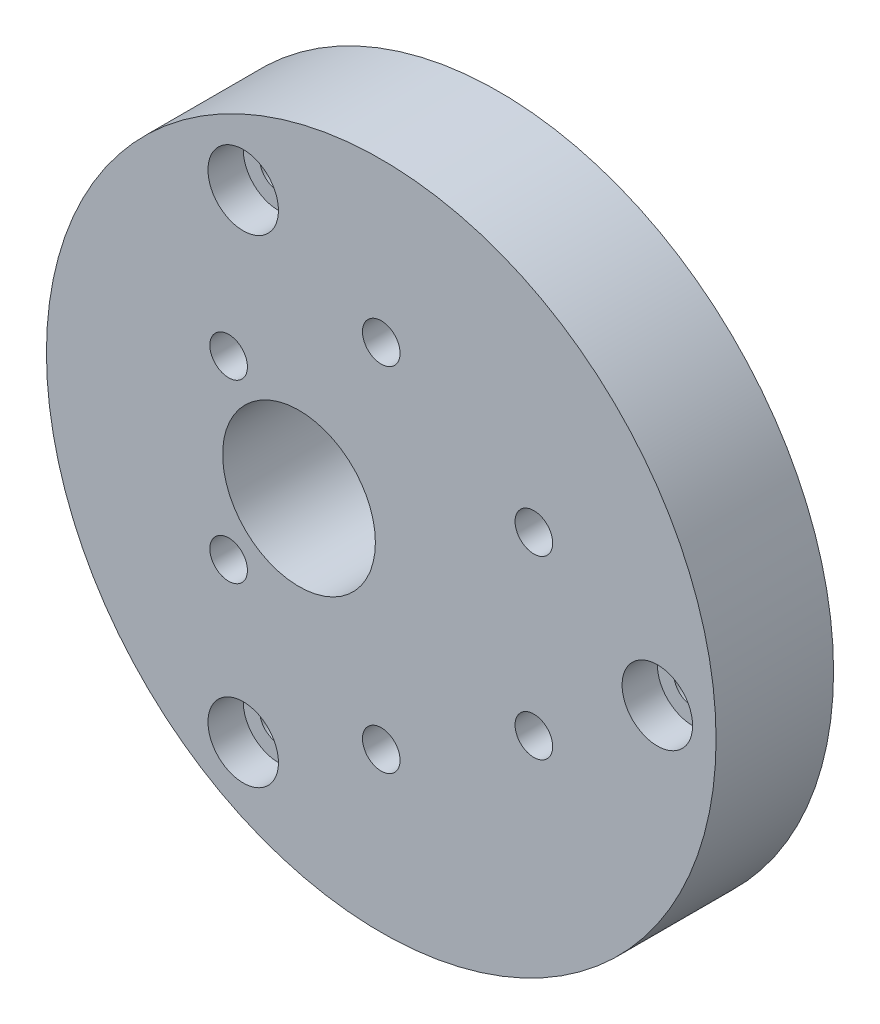
ISO-10303-21;
HEADER;
FILE_DESCRIPTION(('STEP AP214'),'2;1');
FILE_NAME('part.step','',(''),(''),'','','');
FILE_SCHEMA(('AUTOMOTIVE_DESIGN { 1 0 10303 214 1 1 1 1 }'));
ENDSEC;
DATA;
#1=APPLICATION_CONTEXT('core data for automotive mechanical design processes');
#2=APPLICATION_PROTOCOL_DEFINITION('international standard','automotive_design',2000,#1);
#3=PRODUCT_CONTEXT('',#1,'mechanical');
#4=PRODUCT('Part','Part','',(#3));
#5=PRODUCT_RELATED_PRODUCT_CATEGORY('part','',(#4));
#6=PRODUCT_DEFINITION_FORMATION('','',#4);
#7=PRODUCT_DEFINITION_CONTEXT('part definition',#1,'design');
#8=PRODUCT_DEFINITION('design','',#6,#7);
#9=PRODUCT_DEFINITION_SHAPE('','',#8);
#10=(LENGTH_UNIT() NAMED_UNIT(*) SI_UNIT(.MILLI.,.METRE.));
#11=(NAMED_UNIT(*) PLANE_ANGLE_UNIT() SI_UNIT($,.RADIAN.));
#12=(NAMED_UNIT(*) SI_UNIT($,.STERADIAN.) SOLID_ANGLE_UNIT());
#13=UNCERTAINTY_MEASURE_WITH_UNIT(LENGTH_MEASURE(1.E-05),#10,'distance_accuracy_value','');
#14=(GEOMETRIC_REPRESENTATION_CONTEXT(3) GLOBAL_UNCERTAINTY_ASSIGNED_CONTEXT((#13)) GLOBAL_UNIT_ASSIGNED_CONTEXT((#10,
#11,#12)) REPRESENTATION_CONTEXT('',''));
#15=CARTESIAN_POINT('',(0.,0.,0.));
#16=DIRECTION('',(0.,0.,1.));
#17=DIRECTION('',(1.,0.,0.));
#18=AXIS2_PLACEMENT_3D('',#15,#16,#17);
#19=CARTESIAN_POINT('',(0.,0.,0.));
#20=DIRECTION('',(0.,0.,1.));
#21=DIRECTION('',(1.,0.,0.));
#22=AXIS2_PLACEMENT_3D('',#19,#20,#21);
#23=PLANE('',#22);
#24=CARTESIAN_POINT('',(1.54390389361936E-13,-15.,0.));
#25=DIRECTION('',(0.,0.,-1.));
#26=DIRECTION('',(-1.,0.,0.));
#27=AXIS2_PLACEMENT_3D('',#24,#25,#26);
#28=CIRCLE('',#27,3.);
#29=CARTESIAN_POINT('',(-2.99999999999985,-15.,0.));
#30=VERTEX_POINT('',#29);
#31=EDGE_CURVE('E109',#30,#30,#28,.T.);
#32=ORIENTED_EDGE('',*,*,#31,.F.);
#33=EDGE_LOOP('',(#32));
#34=FACE_BOUND('',#33,.T.);
#35=CARTESIAN_POINT('',(-12.9903810567666,-7.50000000000001,0.));
#36=DIRECTION('',(0.,0.,-1.));
#37=DIRECTION('',(-1.,0.,0.));
#38=AXIS2_PLACEMENT_3D('',#35,#36,#37);
#39=CIRCLE('',#38,3.);
#40=CARTESIAN_POINT('',(-15.9903810567666,-7.50000000000001,0.));
#41=VERTEX_POINT('',#40);
#42=EDGE_CURVE('E96',#41,#41,#39,.T.);
#43=ORIENTED_EDGE('',*,*,#42,.F.);
#44=EDGE_LOOP('',(#43));
#45=FACE_BOUND('',#44,.T.);
#46=CARTESIAN_POINT('',(-12.9903810567666,7.49999999999993,0.));
#47=DIRECTION('',(0.,0.,-1.));
#48=DIRECTION('',(-1.,0.,0.));
#49=AXIS2_PLACEMENT_3D('',#46,#47,#48);
#50=CIRCLE('',#49,3.);
#51=CARTESIAN_POINT('',(-15.9903810567666,7.49999999999993,0.));
#52=VERTEX_POINT('',#51);
#53=EDGE_CURVE('E92',#52,#52,#50,.T.);
#54=ORIENTED_EDGE('',*,*,#53,.F.);
#55=EDGE_LOOP('',(#54));
#56=FACE_BOUND('',#55,.T.);
#57=CARTESIAN_POINT('',(12.9903810567666,7.50000000000001,0.));
#58=DIRECTION('',(0.,0.,-1.));
#59=DIRECTION('',(-1.,0.,0.));
#60=AXIS2_PLACEMENT_3D('',#57,#58,#59);
#61=CIRCLE('',#60,3.);
#62=CARTESIAN_POINT('',(9.99038105676657,7.50000000000001,0.));
#63=VERTEX_POINT('',#62);
#64=EDGE_CURVE('E83',#63,#63,#61,.T.);
#65=ORIENTED_EDGE('',*,*,#64,.F.);
#66=EDGE_LOOP('',(#65));
#67=FACE_BOUND('',#66,.T.);
#68=CARTESIAN_POINT('',(-11.7499999999998,20.3515969889344,0.));
#69=DIRECTION('',(0.,0.,1.));
#70=DIRECTION('',(1.,0.,0.));
#71=AXIS2_PLACEMENT_3D('',#68,#69,#70);
#72=CIRCLE('',#71,1.6);
#73=CARTESIAN_POINT('',(-10.1499999999998,20.3515969889344,0.));
#74=VERTEX_POINT('',#73);
#75=EDGE_CURVE('E70',#74,#74,#72,.T.);
#76=ORIENTED_EDGE('',*,*,#75,.T.);
#77=EDGE_LOOP('',(#76));
#78=FACE_BOUND('',#77,.T.);
#79=CARTESIAN_POINT('',(-11.7500000000001,-20.3515969889343,0.));
#80=DIRECTION('',(0.,0.,1.));
#81=DIRECTION('',(1.,0.,0.));
#82=AXIS2_PLACEMENT_3D('',#79,#80,#81);
#83=CIRCLE('',#82,1.6);
#84=CARTESIAN_POINT('',(-10.1500000000001,-20.3515969889343,0.));
#85=VERTEX_POINT('',#84);
#86=EDGE_CURVE('E65',#85,#85,#83,.T.);
#87=ORIENTED_EDGE('',*,*,#86,.T.);
#88=EDGE_LOOP('',(#87));
#89=FACE_BOUND('',#88,.T.);
#90=CARTESIAN_POINT('',(23.5,0.,0.));
#91=DIRECTION('',(0.,0.,1.));
#92=DIRECTION('',(1.,0.,0.));
#93=AXIS2_PLACEMENT_3D('',#90,#91,#92);
#94=CIRCLE('',#93,1.6);
#95=CARTESIAN_POINT('',(25.1,0.,0.));
#96=VERTEX_POINT('',#95);
#97=EDGE_CURVE('E59',#96,#96,#94,.T.);
#98=ORIENTED_EDGE('',*,*,#97,.T.);
#99=EDGE_LOOP('',(#98));
#100=FACE_BOUND('',#99,.T.);
#101=CARTESIAN_POINT('',(0.,0.,0.));
#102=DIRECTION('',(0.,0.,1.));
#103=DIRECTION('',(1.,0.,0.));
#104=AXIS2_PLACEMENT_3D('',#101,#102,#103);
#105=CIRCLE('',#104,28.5);
#106=CARTESIAN_POINT('',(28.5,0.,0.));
#107=VERTEX_POINT('',#106);
#108=EDGE_CURVE('E56',#107,#107,#105,.T.);
#109=ORIENTED_EDGE('',*,*,#108,.F.);
#110=EDGE_LOOP('',(#109));
#111=FACE_BOUND('',#110,.T.);
#112=CARTESIAN_POINT('',(-7.,0.,0.));
#113=DIRECTION('',(0.,0.,1.));
#114=DIRECTION('',(1.,0.,0.));
#115=AXIS2_PLACEMENT_3D('',#112,#113,#114);
#116=CIRCLE('',#115,6.5);
#117=CARTESIAN_POINT('',(-0.5,0.,0.));
#118=VERTEX_POINT('',#117);
#119=EDGE_CURVE('E52',#118,#118,#116,.T.);
#120=ORIENTED_EDGE('',*,*,#119,.T.);
#121=EDGE_LOOP('',(#120));
#122=FACE_BOUND('',#121,.T.);
#123=CARTESIAN_POINT('',(0.,15.,0.));
#124=DIRECTION('',(0.,0.,-1.));
#125=DIRECTION('',(-1.,0.,0.));
#126=AXIS2_PLACEMENT_3D('',#123,#124,#125);
#127=CIRCLE('',#126,3.);
#128=CARTESIAN_POINT('',(-3.00000000000005,15.,0.));
#129=VERTEX_POINT('',#128);
#130=EDGE_CURVE('E88',#129,#129,#127,.T.);
#131=ORIENTED_EDGE('',*,*,#130,.F.);
#132=EDGE_LOOP('',(#131));
#133=FACE_BOUND('',#132,.T.);
#134=CARTESIAN_POINT('',(12.9903810567667,-7.49999999999984,0.));
#135=DIRECTION('',(0.,0.,-1.));
#136=DIRECTION('',(-1.,0.,0.));
#137=AXIS2_PLACEMENT_3D('',#134,#135,#136);
#138=CIRCLE('',#137,3.);
#139=CARTESIAN_POINT('',(9.99038105676667,-7.49999999999984,0.));
#140=VERTEX_POINT('',#139);
#141=EDGE_CURVE('E198',#140,#140,#138,.T.);
#142=ORIENTED_EDGE('',*,*,#141,.F.);
#143=EDGE_LOOP('',(#142));
#144=FACE_BOUND('',#143,.T.);
#145=ADVANCED_FACE('F39',(#34,#45,#56,#67,#78,#89,#100,#111,#122,#133,#144),#23,.F.);
#146=CARTESIAN_POINT('',(0.,0.,10.));
#147=DIRECTION('',(0.,0.,-1.));
#148=DIRECTION('',(-1.,0.,0.));
#149=AXIS2_PLACEMENT_3D('',#146,#147,#148);
#150=CYLINDRICAL_SURFACE('',#149,28.5);
#151=CARTESIAN_POINT('',(0.,0.,10.));
#152=DIRECTION('',(0.,0.,1.));
#153=DIRECTION('',(1.,0.,0.));
#154=AXIS2_PLACEMENT_3D('',#151,#152,#153);
#155=CIRCLE('',#154,28.5);
#156=CARTESIAN_POINT('',(28.5,0.,10.));
#157=VERTEX_POINT('',#156);
#158=EDGE_CURVE('E47',#157,#157,#155,.T.);
#159=ORIENTED_EDGE('',*,*,#158,.F.);
#160=EDGE_LOOP('',(#159));
#161=FACE_BOUND('',#160,.T.);
#162=ORIENTED_EDGE('',*,*,#108,.T.);
#163=EDGE_LOOP('',(#162));
#164=FACE_BOUND('',#163,.T.);
#165=ADVANCED_FACE('F41',(#161,#164),#150,.T.);
#166=CARTESIAN_POINT('',(-7.,0.,10.));
#167=DIRECTION('',(0.,0.,-1.));
#168=DIRECTION('',(-1.,0.,0.));
#169=AXIS2_PLACEMENT_3D('',#166,#167,#168);
#170=CYLINDRICAL_SURFACE('',#169,6.5);
#171=CARTESIAN_POINT('',(-7.,0.,10.));
#172=DIRECTION('',(0.,0.,1.));
#173=DIRECTION('',(1.,0.,0.));
#174=AXIS2_PLACEMENT_3D('',#171,#172,#173);
#175=CIRCLE('',#174,6.5);
#176=CARTESIAN_POINT('',(-0.5,0.,10.));
#177=VERTEX_POINT('',#176);
#178=EDGE_CURVE('E10',#177,#177,#175,.T.);
#179=ORIENTED_EDGE('',*,*,#178,.T.);
#180=EDGE_LOOP('',(#179));
#181=FACE_BOUND('',#180,.T.);
#182=ORIENTED_EDGE('',*,*,#119,.F.);
#183=EDGE_LOOP('',(#182));
#184=FACE_BOUND('',#183,.T.);
#185=ADVANCED_FACE('F178',(#181,#184),#170,.F.);
#186=CARTESIAN_POINT('',(0.,0.,10.));
#187=DIRECTION('',(0.,0.,1.));
#188=DIRECTION('',(1.,0.,0.));
#189=AXIS2_PLACEMENT_3D('',#186,#187,#188);
#190=PLANE('',#189);
#191=CARTESIAN_POINT('',(12.9903810567667,-7.49999999999984,10.));
#192=DIRECTION('',(0.,0.,1.));
#193=DIRECTION('',(1.,0.,0.));
#194=AXIS2_PLACEMENT_3D('',#191,#192,#193);
#195=CIRCLE('',#194,1.6);
#196=CARTESIAN_POINT('',(14.5903810567667,-7.49999999999984,10.));
#197=VERTEX_POINT('',#196);
#198=EDGE_CURVE('E43',#197,#197,#195,.T.);
#199=ORIENTED_EDGE('',*,*,#198,.F.);
#200=EDGE_LOOP('',(#199));
#201=FACE_BOUND('',#200,.T.);
#202=CARTESIAN_POINT('',(1.54390389361936E-13,-15.,10.));
#203=DIRECTION('',(0.,0.,1.));
#204=DIRECTION('',(1.,0.,0.));
#205=AXIS2_PLACEMENT_3D('',#202,#203,#204);
#206=CIRCLE('',#205,1.6);
#207=CARTESIAN_POINT('',(1.60000000000015,-15.,10.));
#208=VERTEX_POINT('',#207);
#209=EDGE_CURVE('E94',#208,#208,#206,.T.);
#210=ORIENTED_EDGE('',*,*,#209,.F.);
#211=EDGE_LOOP('',(#210));
#212=FACE_BOUND('',#211,.T.);
#213=CARTESIAN_POINT('',(-12.9903810567666,-7.50000000000001,10.));
#214=DIRECTION('',(0.,0.,1.));
#215=DIRECTION('',(1.,0.,0.));
#216=AXIS2_PLACEMENT_3D('',#213,#214,#215);
#217=CIRCLE('',#216,1.6);
#218=CARTESIAN_POINT('',(-11.3903810567666,-7.50000000000001,10.));
#219=VERTEX_POINT('',#218);
#220=EDGE_CURVE('E90',#219,#219,#217,.T.);
#221=ORIENTED_EDGE('',*,*,#220,.F.);
#222=EDGE_LOOP('',(#221));
#223=FACE_BOUND('',#222,.T.);
#224=CARTESIAN_POINT('',(-12.9903810567666,7.49999999999993,10.));
#225=DIRECTION('',(0.,0.,1.));
#226=DIRECTION('',(1.,0.,0.));
#227=AXIS2_PLACEMENT_3D('',#224,#225,#226);
#228=CIRCLE('',#227,1.6);
#229=CARTESIAN_POINT('',(-11.3903810567666,7.49999999999993,10.));
#230=VERTEX_POINT('',#229);
#231=EDGE_CURVE('E85',#230,#230,#228,.T.);
#232=ORIENTED_EDGE('',*,*,#231,.F.);
#233=EDGE_LOOP('',(#232));
#234=FACE_BOUND('',#233,.T.);
#235=CARTESIAN_POINT('',(0.,15.,10.));
#236=DIRECTION('',(0.,0.,1.));
#237=DIRECTION('',(1.,0.,0.));
#238=AXIS2_PLACEMENT_3D('',#235,#236,#237);
#239=CIRCLE('',#238,1.6);
#240=CARTESIAN_POINT('',(1.59999999999995,15.,10.));
#241=VERTEX_POINT('',#240);
#242=EDGE_CURVE('E80',#241,#241,#239,.T.);
#243=ORIENTED_EDGE('',*,*,#242,.F.);
#244=EDGE_LOOP('',(#243));
#245=FACE_BOUND('',#244,.T.);
#246=CARTESIAN_POINT('',(12.9903810567666,7.50000000000001,10.));
#247=DIRECTION('',(0.,0.,1.));
#248=DIRECTION('',(1.,0.,0.));
#249=AXIS2_PLACEMENT_3D('',#246,#247,#248);
#250=CIRCLE('',#249,1.6);
#251=CARTESIAN_POINT('',(14.5903810567666,7.50000000000001,10.));
#252=VERTEX_POINT('',#251);
#253=EDGE_CURVE('E75',#252,#252,#250,.T.);
#254=ORIENTED_EDGE('',*,*,#253,.F.);
#255=EDGE_LOOP('',(#254));
#256=FACE_BOUND('',#255,.T.);
#257=CARTESIAN_POINT('',(-11.7499999999998,20.3515969889344,10.));
#258=DIRECTION('',(0.,0.,1.));
#259=DIRECTION('',(1.,0.,0.));
#260=AXIS2_PLACEMENT_3D('',#257,#258,#259);
#261=CIRCLE('',#260,3.);
#262=CARTESIAN_POINT('',(-8.74999999999981,20.3515969889344,10.));
#263=VERTEX_POINT('',#262);
#264=EDGE_CURVE('E78',#263,#263,#261,.T.);
#265=ORIENTED_EDGE('',*,*,#264,.F.);
#266=EDGE_LOOP('',(#265));
#267=FACE_BOUND('',#266,.T.);
#268=CARTESIAN_POINT('',(-11.7500000000001,-20.3515969889343,10.));
#269=DIRECTION('',(0.,0.,1.));
#270=DIRECTION('',(1.,0.,0.));
#271=AXIS2_PLACEMENT_3D('',#268,#269,#270);
#272=CIRCLE('',#271,3.);
#273=CARTESIAN_POINT('',(-8.7500000000001,-20.3515969889343,10.));
#274=VERTEX_POINT('',#273);
#275=EDGE_CURVE('E73',#274,#274,#272,.T.);
#276=ORIENTED_EDGE('',*,*,#275,.F.);
#277=EDGE_LOOP('',(#276));
#278=FACE_BOUND('',#277,.T.);
#279=CARTESIAN_POINT('',(23.5,0.,10.));
#280=DIRECTION('',(0.,0.,1.));
#281=DIRECTION('',(1.,0.,0.));
#282=AXIS2_PLACEMENT_3D('',#279,#280,#281);
#283=CIRCLE('',#282,3.);
#284=CARTESIAN_POINT('',(26.5,0.,10.));
#285=VERTEX_POINT('',#284);
#286=EDGE_CURVE('E68',#285,#285,#283,.T.);
#287=ORIENTED_EDGE('',*,*,#286,.F.);
#288=EDGE_LOOP('',(#287));
#289=FACE_BOUND('',#288,.T.);
#290=ORIENTED_EDGE('',*,*,#158,.T.);
#291=EDGE_LOOP('',(#290));
#292=FACE_BOUND('',#291,.T.);
#293=ORIENTED_EDGE('',*,*,#178,.F.);
#294=EDGE_LOOP('',(#293));
#295=FACE_BOUND('',#294,.T.);
#296=ADVANCED_FACE('F175',(#201,#212,#223,#234,#245,#256,#267,#278,#289,#292,#295),#190,.T.);
#297=CARTESIAN_POINT('',(23.5,0.,10.));
#298=DIRECTION('',(0.,0.,1.));
#299=DIRECTION('',(1.,0.,0.));
#300=AXIS2_PLACEMENT_3D('',#297,#298,#299);
#301=CYLINDRICAL_SURFACE('',#300,1.6);
#302=CARTESIAN_POINT('',(23.5,0.,7.));
#303=DIRECTION('',(0.,0.,1.));
#304=DIRECTION('',(1.,0.,0.));
#305=AXIS2_PLACEMENT_3D('',#302,#303,#304);
#306=CIRCLE('',#305,1.6);
#307=CARTESIAN_POINT('',(25.1,0.,7.));
#308=VERTEX_POINT('',#307);
#309=EDGE_CURVE('E64',#308,#308,#306,.T.);
#310=ORIENTED_EDGE('',*,*,#309,.T.);
#311=EDGE_LOOP('',(#310));
#312=FACE_BOUND('',#311,.T.);
#313=ORIENTED_EDGE('',*,*,#97,.F.);
#314=EDGE_LOOP('',(#313));
#315=FACE_BOUND('',#314,.T.);
#316=ADVANCED_FACE('F159',(#312,#315),#301,.F.);
#317=CARTESIAN_POINT('',(25.1,0.,7.));
#318=DIRECTION('',(0.,0.,-1.));
#319=DIRECTION('',(-1.,0.,0.));
#320=AXIS2_PLACEMENT_3D('',#317,#318,#319);
#321=PLANE('',#320);
#322=ORIENTED_EDGE('',*,*,#309,.F.);
#323=EDGE_LOOP('',(#322));
#324=FACE_BOUND('',#323,.T.);
#325=CARTESIAN_POINT('',(23.5,0.,7.));
#326=DIRECTION('',(0.,0.,1.));
#327=DIRECTION('',(1.,0.,0.));
#328=AXIS2_PLACEMENT_3D('',#325,#326,#327);
#329=CIRCLE('',#328,3.);
#330=CARTESIAN_POINT('',(26.5,0.,7.));
#331=VERTEX_POINT('',#330);
#332=EDGE_CURVE('E154',#331,#331,#329,.T.);
#333=ORIENTED_EDGE('',*,*,#332,.T.);
#334=EDGE_LOOP('',(#333));
#335=FACE_BOUND('',#334,.T.);
#336=ADVANCED_FACE('F162',(#324,#335),#321,.F.);
#337=CARTESIAN_POINT('',(23.5,0.,10.));
#338=DIRECTION('',(0.,0.,1.));
#339=DIRECTION('',(1.,0.,0.));
#340=AXIS2_PLACEMENT_3D('',#337,#338,#339);
#341=CYLINDRICAL_SURFACE('',#340,3.);
#342=ORIENTED_EDGE('',*,*,#332,.F.);
#343=EDGE_LOOP('',(#342));
#344=FACE_BOUND('',#343,.T.);
#345=ORIENTED_EDGE('',*,*,#286,.T.);
#346=EDGE_LOOP('',(#345));
#347=FACE_BOUND('',#346,.T.);
#348=ADVANCED_FACE('F165',(#344,#347),#341,.F.);
#349=CARTESIAN_POINT('',(-11.7500000000001,-20.3515969889343,10.));
#350=DIRECTION('',(0.,0.,1.));
#351=DIRECTION('',(1.,0.,0.));
#352=AXIS2_PLACEMENT_3D('',#349,#350,#351);
#353=CYLINDRICAL_SURFACE('',#352,1.6);
#354=CARTESIAN_POINT('',(-11.7500000000001,-20.3515969889343,7.));
#355=DIRECTION('',(0.,0.,1.));
#356=DIRECTION('',(1.,0.,0.));
#357=AXIS2_PLACEMENT_3D('',#354,#355,#356);
#358=CIRCLE('',#357,1.6);
#359=CARTESIAN_POINT('',(-10.1500000000001,-20.3515969889343,7.));
#360=VERTEX_POINT('',#359);
#361=EDGE_CURVE('E69',#360,#360,#358,.T.);
#362=ORIENTED_EDGE('',*,*,#361,.T.);
#363=EDGE_LOOP('',(#362));
#364=FACE_BOUND('',#363,.T.);
#365=ORIENTED_EDGE('',*,*,#86,.F.);
#366=EDGE_LOOP('',(#365));
#367=FACE_BOUND('',#366,.T.);
#368=ADVANCED_FACE('F171',(#364,#367),#353,.F.);
#369=CARTESIAN_POINT('',(-10.1500000000001,-20.3515969889343,7.));
#370=DIRECTION('',(0.,0.,-1.));
#371=DIRECTION('',(-1.,0.,0.));
#372=AXIS2_PLACEMENT_3D('',#369,#370,#371);
#373=PLANE('',#372);
#374=ORIENTED_EDGE('',*,*,#361,.F.);
#375=EDGE_LOOP('',(#374));
#376=FACE_BOUND('',#375,.T.);
#377=CARTESIAN_POINT('',(-11.7500000000001,-20.3515969889343,7.));
#378=DIRECTION('',(0.,0.,1.));
#379=DIRECTION('',(1.,0.,0.));
#380=AXIS2_PLACEMENT_3D('',#377,#378,#379);
#381=CIRCLE('',#380,3.);
#382=CARTESIAN_POINT('',(-8.7500000000001,-20.3515969889343,7.));
#383=VERTEX_POINT('',#382);
#384=EDGE_CURVE('E147',#383,#383,#381,.T.);
#385=ORIENTED_EDGE('',*,*,#384,.T.);
#386=EDGE_LOOP('',(#385));
#387=FACE_BOUND('',#386,.T.);
#388=ADVANCED_FACE('F232',(#376,#387),#373,.F.);
#389=CARTESIAN_POINT('',(-11.7500000000001,-20.3515969889343,10.));
#390=DIRECTION('',(0.,0.,1.));
#391=DIRECTION('',(1.,0.,0.));
#392=AXIS2_PLACEMENT_3D('',#389,#390,#391);
#393=CYLINDRICAL_SURFACE('',#392,3.);
#394=ORIENTED_EDGE('',*,*,#384,.F.);
#395=EDGE_LOOP('',(#394));
#396=FACE_BOUND('',#395,.T.);
#397=ORIENTED_EDGE('',*,*,#275,.T.);
#398=EDGE_LOOP('',(#397));
#399=FACE_BOUND('',#398,.T.);
#400=ADVANCED_FACE('F229',(#396,#399),#393,.F.);
#401=CARTESIAN_POINT('',(-11.7499999999998,20.3515969889344,10.));
#402=DIRECTION('',(0.,0.,1.));
#403=DIRECTION('',(1.,0.,0.));
#404=AXIS2_PLACEMENT_3D('',#401,#402,#403);
#405=CYLINDRICAL_SURFACE('',#404,1.6);
#406=CARTESIAN_POINT('',(-11.7499999999998,20.3515969889344,7.));
#407=DIRECTION('',(0.,0.,1.));
#408=DIRECTION('',(1.,0.,0.));
#409=AXIS2_PLACEMENT_3D('',#406,#407,#408);
#410=CIRCLE('',#409,1.6);
#411=CARTESIAN_POINT('',(-10.1499999999998,20.3515969889344,7.));
#412=VERTEX_POINT('',#411);
#413=EDGE_CURVE('E74',#412,#412,#410,.T.);
#414=ORIENTED_EDGE('',*,*,#413,.T.);
#415=EDGE_LOOP('',(#414));
#416=FACE_BOUND('',#415,.T.);
#417=ORIENTED_EDGE('',*,*,#75,.F.);
#418=EDGE_LOOP('',(#417));
#419=FACE_BOUND('',#418,.T.);
#420=ADVANCED_FACE('F231',(#416,#419),#405,.F.);
#421=CARTESIAN_POINT('',(-10.1499999999998,20.3515969889344,7.));
#422=DIRECTION('',(0.,0.,-1.));
#423=DIRECTION('',(-1.,0.,0.));
#424=AXIS2_PLACEMENT_3D('',#421,#422,#423);
#425=PLANE('',#424);
#426=ORIENTED_EDGE('',*,*,#413,.F.);
#427=EDGE_LOOP('',(#426));
#428=FACE_BOUND('',#427,.T.);
#429=CARTESIAN_POINT('',(-11.7499999999998,20.3515969889344,7.));
#430=DIRECTION('',(0.,0.,1.));
#431=DIRECTION('',(1.,0.,0.));
#432=AXIS2_PLACEMENT_3D('',#429,#430,#431);
#433=CIRCLE('',#432,3.);
#434=CARTESIAN_POINT('',(-8.74999999999981,20.3515969889344,7.));
#435=VERTEX_POINT('',#434);
#436=EDGE_CURVE('E140',#435,#435,#433,.T.);
#437=ORIENTED_EDGE('',*,*,#436,.T.);
#438=EDGE_LOOP('',(#437));
#439=FACE_BOUND('',#438,.T.);
#440=ADVANCED_FACE('F239',(#428,#439),#425,.F.);
#441=CARTESIAN_POINT('',(-11.7499999999998,20.3515969889344,10.));
#442=DIRECTION('',(0.,0.,1.));
#443=DIRECTION('',(1.,0.,0.));
#444=AXIS2_PLACEMENT_3D('',#441,#442,#443);
#445=CYLINDRICAL_SURFACE('',#444,3.);
#446=ORIENTED_EDGE('',*,*,#436,.F.);
#447=EDGE_LOOP('',(#446));
#448=FACE_BOUND('',#447,.T.);
#449=ORIENTED_EDGE('',*,*,#264,.T.);
#450=EDGE_LOOP('',(#449));
#451=FACE_BOUND('',#450,.T.);
#452=ADVANCED_FACE('F304',(#448,#451),#445,.F.);
#453=CARTESIAN_POINT('',(12.9903810567666,7.50000000000001,0.));
#454=DIRECTION('',(0.,0.,-1.));
#455=DIRECTION('',(-1.,0.,0.));
#456=AXIS2_PLACEMENT_3D('',#453,#454,#455);
#457=CYLINDRICAL_SURFACE('',#456,1.6);
#458=ORIENTED_EDGE('',*,*,#253,.T.);
#459=EDGE_LOOP('',(#458));
#460=FACE_BOUND('',#459,.T.);
#461=CARTESIAN_POINT('',(12.9903810567666,7.50000000000001,3.));
#462=DIRECTION('',(0.,0.,-1.));
#463=DIRECTION('',(-1.,0.,0.));
#464=AXIS2_PLACEMENT_3D('',#461,#462,#463);
#465=CIRCLE('',#464,1.6);
#466=CARTESIAN_POINT('',(11.3903810567666,7.50000000000001,3.));
#467=VERTEX_POINT('',#466);
#468=EDGE_CURVE('E79',#467,#467,#465,.T.);
#469=ORIENTED_EDGE('',*,*,#468,.T.);
#470=EDGE_LOOP('',(#469));
#471=FACE_BOUND('',#470,.T.);
#472=ADVANCED_FACE('F313',(#460,#471),#457,.F.);
#473=CARTESIAN_POINT('',(14.5903810567666,7.50000000000001,3.));
#474=DIRECTION('',(0.,0.,1.));
#475=DIRECTION('',(1.,0.,0.));
#476=AXIS2_PLACEMENT_3D('',#473,#474,#475);
#477=PLANE('',#476);
#478=ORIENTED_EDGE('',*,*,#468,.F.);
#479=EDGE_LOOP('',(#478));
#480=FACE_BOUND('',#479,.T.);
#481=CARTESIAN_POINT('',(12.9903810567666,7.50000000000001,3.));
#482=DIRECTION('',(0.,0.,-1.));
#483=DIRECTION('',(-1.,0.,0.));
#484=AXIS2_PLACEMENT_3D('',#481,#482,#483);
#485=CIRCLE('',#484,3.);
#486=CARTESIAN_POINT('',(9.99038105676657,7.50000000000001,3.));
#487=VERTEX_POINT('',#486);
#488=EDGE_CURVE('E133',#487,#487,#485,.T.);
#489=ORIENTED_EDGE('',*,*,#488,.T.);
#490=EDGE_LOOP('',(#489));
#491=FACE_BOUND('',#490,.T.);
#492=ADVANCED_FACE('F323',(#480,#491),#477,.F.);
#493=CARTESIAN_POINT('',(12.9903810567666,7.50000000000001,0.));
#494=DIRECTION('',(0.,0.,-1.));
#495=DIRECTION('',(-1.,0.,0.));
#496=AXIS2_PLACEMENT_3D('',#493,#494,#495);
#497=CYLINDRICAL_SURFACE('',#496,3.);
#498=ORIENTED_EDGE('',*,*,#488,.F.);
#499=EDGE_LOOP('',(#498));
#500=FACE_BOUND('',#499,.T.);
#501=ORIENTED_EDGE('',*,*,#64,.T.);
#502=EDGE_LOOP('',(#501));
#503=FACE_BOUND('',#502,.T.);
#504=ADVANCED_FACE('F333',(#500,#503),#497,.F.);
#505=CARTESIAN_POINT('',(0.,15.,0.));
#506=DIRECTION('',(0.,0.,-1.));
#507=DIRECTION('',(-1.,0.,0.));
#508=AXIS2_PLACEMENT_3D('',#505,#506,#507);
#509=CYLINDRICAL_SURFACE('',#508,1.6);
#510=ORIENTED_EDGE('',*,*,#242,.T.);
#511=EDGE_LOOP('',(#510));
#512=FACE_BOUND('',#511,.T.);
#513=CARTESIAN_POINT('',(0.,15.,3.));
#514=DIRECTION('',(0.,0.,-1.));
#515=DIRECTION('',(-1.,0.,0.));
#516=AXIS2_PLACEMENT_3D('',#513,#514,#515);
#517=CIRCLE('',#516,1.6);
#518=CARTESIAN_POINT('',(-1.60000000000005,15.,3.));
#519=VERTEX_POINT('',#518);
#520=EDGE_CURVE('E84',#519,#519,#517,.T.);
#521=ORIENTED_EDGE('',*,*,#520,.T.);
#522=EDGE_LOOP('',(#521));
#523=FACE_BOUND('',#522,.T.);
#524=ADVANCED_FACE('F343',(#512,#523),#509,.F.);
#525=CARTESIAN_POINT('',(1.59999999999995,15.,3.));
#526=DIRECTION('',(0.,0.,1.));
#527=DIRECTION('',(1.,0.,0.));
#528=AXIS2_PLACEMENT_3D('',#525,#526,#527);
#529=PLANE('',#528);
#530=ORIENTED_EDGE('',*,*,#520,.F.);
#531=EDGE_LOOP('',(#530));
#532=FACE_BOUND('',#531,.T.);
#533=CARTESIAN_POINT('',(0.,15.,3.));
#534=DIRECTION('',(0.,0.,-1.));
#535=DIRECTION('',(-1.,0.,0.));
#536=AXIS2_PLACEMENT_3D('',#533,#534,#535);
#537=CIRCLE('',#536,3.);
#538=CARTESIAN_POINT('',(-3.00000000000005,15.,3.));
#539=VERTEX_POINT('',#538);
#540=EDGE_CURVE('E126',#539,#539,#537,.T.);
#541=ORIENTED_EDGE('',*,*,#540,.T.);
#542=EDGE_LOOP('',(#541));
#543=FACE_BOUND('',#542,.T.);
#544=ADVANCED_FACE('F362',(#532,#543),#529,.F.);
#545=CARTESIAN_POINT('',(0.,15.,0.));
#546=DIRECTION('',(0.,0.,-1.));
#547=DIRECTION('',(-1.,0.,0.));
#548=AXIS2_PLACEMENT_3D('',#545,#546,#547);
#549=CYLINDRICAL_SURFACE('',#548,3.);
#550=ORIENTED_EDGE('',*,*,#540,.F.);
#551=EDGE_LOOP('',(#550));
#552=FACE_BOUND('',#551,.T.);
#553=ORIENTED_EDGE('',*,*,#130,.T.);
#554=EDGE_LOOP('',(#553));
#555=FACE_BOUND('',#554,.T.);
#556=ADVANCED_FACE('F372',(#552,#555),#549,.F.);
#557=CARTESIAN_POINT('',(-12.9903810567666,7.49999999999993,0.));
#558=DIRECTION('',(0.,0.,-1.));
#559=DIRECTION('',(-1.,0.,0.));
#560=AXIS2_PLACEMENT_3D('',#557,#558,#559);
#561=CYLINDRICAL_SURFACE('',#560,1.6);
#562=ORIENTED_EDGE('',*,*,#231,.T.);
#563=EDGE_LOOP('',(#562));
#564=FACE_BOUND('',#563,.T.);
#565=CARTESIAN_POINT('',(-12.9903810567666,7.49999999999993,3.));
#566=DIRECTION('',(0.,0.,-1.));
#567=DIRECTION('',(-1.,0.,0.));
#568=AXIS2_PLACEMENT_3D('',#565,#566,#567);
#569=CIRCLE('',#568,1.6);
#570=CARTESIAN_POINT('',(-14.5903810567666,7.49999999999993,3.));
#571=VERTEX_POINT('',#570);
#572=EDGE_CURVE('E89',#571,#571,#569,.T.);
#573=ORIENTED_EDGE('',*,*,#572,.T.);
#574=EDGE_LOOP('',(#573));
#575=FACE_BOUND('',#574,.T.);
#576=ADVANCED_FACE('F382',(#564,#575),#561,.F.);
#577=CARTESIAN_POINT('',(-11.3903810567666,7.49999999999993,3.));
#578=DIRECTION('',(0.,0.,1.));
#579=DIRECTION('',(1.,0.,0.));
#580=AXIS2_PLACEMENT_3D('',#577,#578,#579);
#581=PLANE('',#580);
#582=ORIENTED_EDGE('',*,*,#572,.F.);
#583=EDGE_LOOP('',(#582));
#584=FACE_BOUND('',#583,.T.);
#585=CARTESIAN_POINT('',(-12.9903810567666,7.49999999999993,3.));
#586=DIRECTION('',(0.,0.,-1.));
#587=DIRECTION('',(-1.,0.,0.));
#588=AXIS2_PLACEMENT_3D('',#585,#586,#587);
#589=CIRCLE('',#588,3.);
#590=CARTESIAN_POINT('',(-15.9903810567666,7.49999999999993,3.));
#591=VERTEX_POINT('',#590);
#592=EDGE_CURVE('E119',#591,#591,#589,.T.);
#593=ORIENTED_EDGE('',*,*,#592,.T.);
#594=EDGE_LOOP('',(#593));
#595=FACE_BOUND('',#594,.T.);
#596=ADVANCED_FACE('F392',(#584,#595),#581,.F.);
#597=CARTESIAN_POINT('',(-12.9903810567666,7.49999999999993,0.));
#598=DIRECTION('',(0.,0.,-1.));
#599=DIRECTION('',(-1.,0.,0.));
#600=AXIS2_PLACEMENT_3D('',#597,#598,#599);
#601=CYLINDRICAL_SURFACE('',#600,3.);
#602=ORIENTED_EDGE('',*,*,#592,.F.);
#603=EDGE_LOOP('',(#602));
#604=FACE_BOUND('',#603,.T.);
#605=ORIENTED_EDGE('',*,*,#53,.T.);
#606=EDGE_LOOP('',(#605));
#607=FACE_BOUND('',#606,.T.);
#608=ADVANCED_FACE('F402',(#604,#607),#601,.F.);
#609=CARTESIAN_POINT('',(-12.9903810567666,-7.50000000000001,0.));
#610=DIRECTION('',(0.,0.,-1.));
#611=DIRECTION('',(-1.,0.,0.));
#612=AXIS2_PLACEMENT_3D('',#609,#610,#611);
#613=CYLINDRICAL_SURFACE('',#612,1.6);
#614=ORIENTED_EDGE('',*,*,#220,.T.);
#615=EDGE_LOOP('',(#614));
#616=FACE_BOUND('',#615,.T.);
#617=CARTESIAN_POINT('',(-12.9903810567666,-7.50000000000001,3.));
#618=DIRECTION('',(0.,0.,-1.));
#619=DIRECTION('',(-1.,0.,0.));
#620=AXIS2_PLACEMENT_3D('',#617,#618,#619);
#621=CIRCLE('',#620,1.6);
#622=CARTESIAN_POINT('',(-14.5903810567666,-7.50000000000001,3.));
#623=VERTEX_POINT('',#622);
#624=EDGE_CURVE('E93',#623,#623,#621,.T.);
#625=ORIENTED_EDGE('',*,*,#624,.T.);
#626=EDGE_LOOP('',(#625));
#627=FACE_BOUND('',#626,.T.);
#628=ADVANCED_FACE('F412',(#616,#627),#613,.F.);
#629=CARTESIAN_POINT('',(-11.3903810567666,-7.50000000000001,3.));
#630=DIRECTION('',(0.,0.,1.));
#631=DIRECTION('',(1.,0.,0.));
#632=AXIS2_PLACEMENT_3D('',#629,#630,#631);
#633=PLANE('',#632);
#634=ORIENTED_EDGE('',*,*,#624,.F.);
#635=EDGE_LOOP('',(#634));
#636=FACE_BOUND('',#635,.T.);
#637=CARTESIAN_POINT('',(-12.9903810567666,-7.50000000000001,3.));
#638=DIRECTION('',(0.,0.,-1.));
#639=DIRECTION('',(-1.,0.,0.));
#640=AXIS2_PLACEMENT_3D('',#637,#638,#639);
#641=CIRCLE('',#640,3.);
#642=CARTESIAN_POINT('',(-15.9903810567666,-7.50000000000001,3.));
#643=VERTEX_POINT('',#642);
#644=EDGE_CURVE('E101',#643,#643,#641,.T.);
#645=ORIENTED_EDGE('',*,*,#644,.T.);
#646=EDGE_LOOP('',(#645));
#647=FACE_BOUND('',#646,.T.);
#648=ADVANCED_FACE('F422',(#636,#647),#633,.F.);
#649=CARTESIAN_POINT('',(-12.9903810567666,-7.50000000000001,0.));
#650=DIRECTION('',(0.,0.,-1.));
#651=DIRECTION('',(-1.,0.,0.));
#652=AXIS2_PLACEMENT_3D('',#649,#650,#651);
#653=CYLINDRICAL_SURFACE('',#652,3.);
#654=ORIENTED_EDGE('',*,*,#644,.F.);
#655=EDGE_LOOP('',(#654));
#656=FACE_BOUND('',#655,.T.);
#657=ORIENTED_EDGE('',*,*,#42,.T.);
#658=EDGE_LOOP('',(#657));
#659=FACE_BOUND('',#658,.T.);
#660=ADVANCED_FACE('F432',(#656,#659),#653,.F.);
#661=CARTESIAN_POINT('',(1.54390389361936E-13,-15.,0.));
#662=DIRECTION('',(0.,0.,-1.));
#663=DIRECTION('',(-1.,0.,0.));
#664=AXIS2_PLACEMENT_3D('',#661,#662,#663);
#665=CYLINDRICAL_SURFACE('',#664,1.6);
#666=ORIENTED_EDGE('',*,*,#209,.T.);
#667=EDGE_LOOP('',(#666));
#668=FACE_BOUND('',#667,.T.);
#669=CARTESIAN_POINT('',(1.54390389361936E-13,-15.,3.));
#670=DIRECTION('',(0.,0.,-1.));
#671=DIRECTION('',(-1.,0.,0.));
#672=AXIS2_PLACEMENT_3D('',#669,#670,#671);
#673=CIRCLE('',#672,1.6);
#674=CARTESIAN_POINT('',(-1.59999999999984,-15.,3.));
#675=VERTEX_POINT('',#674);
#676=EDGE_CURVE('E97',#675,#675,#673,.T.);
#677=ORIENTED_EDGE('',*,*,#676,.T.);
#678=EDGE_LOOP('',(#677));
#679=FACE_BOUND('',#678,.T.);
#680=ADVANCED_FACE('F442',(#668,#679),#665,.F.);
#681=CARTESIAN_POINT('',(1.60000000000015,-15.,3.));
#682=DIRECTION('',(0.,0.,1.));
#683=DIRECTION('',(1.,0.,0.));
#684=AXIS2_PLACEMENT_3D('',#681,#682,#683);
#685=PLANE('',#684);
#686=ORIENTED_EDGE('',*,*,#676,.F.);
#687=EDGE_LOOP('',(#686));
#688=FACE_BOUND('',#687,.T.);
#689=CARTESIAN_POINT('',(1.54390389361936E-13,-15.,3.));
#690=DIRECTION('',(0.,0.,-1.));
#691=DIRECTION('',(-1.,0.,0.));
#692=AXIS2_PLACEMENT_3D('',#689,#690,#691);
#693=CIRCLE('',#692,3.);
#694=CARTESIAN_POINT('',(-2.99999999999985,-15.,3.));
#695=VERTEX_POINT('',#694);
#696=EDGE_CURVE('E104',#695,#695,#693,.T.);
#697=ORIENTED_EDGE('',*,*,#696,.T.);
#698=EDGE_LOOP('',(#697));
#699=FACE_BOUND('',#698,.T.);
#700=ADVANCED_FACE('F452',(#688,#699),#685,.F.);
#701=CARTESIAN_POINT('',(1.54390389361936E-13,-15.,0.));
#702=DIRECTION('',(0.,0.,-1.));
#703=DIRECTION('',(-1.,0.,0.));
#704=AXIS2_PLACEMENT_3D('',#701,#702,#703);
#705=CYLINDRICAL_SURFACE('',#704,3.);
#706=ORIENTED_EDGE('',*,*,#696,.F.);
#707=EDGE_LOOP('',(#706));
#708=FACE_BOUND('',#707,.T.);
#709=ORIENTED_EDGE('',*,*,#31,.T.);
#710=EDGE_LOOP('',(#709));
#711=FACE_BOUND('',#710,.T.);
#712=ADVANCED_FACE('F461',(#708,#711),#705,.F.);
#713=CARTESIAN_POINT('',(12.9903810567667,-7.49999999999984,0.));
#714=DIRECTION('',(0.,0.,-1.));
#715=DIRECTION('',(-1.,0.,0.));
#716=AXIS2_PLACEMENT_3D('',#713,#714,#715);
#717=CYLINDRICAL_SURFACE('',#716,1.6);
#718=ORIENTED_EDGE('',*,*,#198,.T.);
#719=EDGE_LOOP('',(#718));
#720=FACE_BOUND('',#719,.T.);
#721=CARTESIAN_POINT('',(12.9903810567667,-7.49999999999984,3.));
#722=DIRECTION('',(0.,0.,-1.));
#723=DIRECTION('',(-1.,0.,0.));
#724=AXIS2_PLACEMENT_3D('',#721,#722,#723);
#725=CIRCLE('',#724,1.6);
#726=CARTESIAN_POINT('',(11.3903810567667,-7.49999999999984,3.));
#727=VERTEX_POINT('',#726);
#728=EDGE_CURVE('E203',#727,#727,#725,.T.);
#729=ORIENTED_EDGE('',*,*,#728,.T.);
#730=EDGE_LOOP('',(#729));
#731=FACE_BOUND('',#730,.T.);
#732=ADVANCED_FACE('F213',(#720,#731),#717,.F.);
#733=CARTESIAN_POINT('',(14.5903810567667,-7.49999999999984,3.));
#734=DIRECTION('',(0.,0.,1.));
#735=DIRECTION('',(1.,0.,0.));
#736=AXIS2_PLACEMENT_3D('',#733,#734,#735);
#737=PLANE('',#736);
#738=ORIENTED_EDGE('',*,*,#728,.F.);
#739=EDGE_LOOP('',(#738));
#740=FACE_BOUND('',#739,.T.);
#741=CARTESIAN_POINT('',(12.9903810567667,-7.49999999999984,3.));
#742=DIRECTION('',(0.,0.,-1.));
#743=DIRECTION('',(-1.,0.,0.));
#744=AXIS2_PLACEMENT_3D('',#741,#742,#743);
#745=CIRCLE('',#744,3.);
#746=CARTESIAN_POINT('',(9.99038105676667,-7.49999999999984,3.));
#747=VERTEX_POINT('',#746);
#748=EDGE_CURVE('E200',#747,#747,#745,.T.);
#749=ORIENTED_EDGE('',*,*,#748,.T.);
#750=EDGE_LOOP('',(#749));
#751=FACE_BOUND('',#750,.T.);
#752=ADVANCED_FACE('F480',(#740,#751),#737,.F.);
#753=CARTESIAN_POINT('',(12.9903810567667,-7.49999999999984,0.));
#754=DIRECTION('',(0.,0.,-1.));
#755=DIRECTION('',(-1.,0.,0.));
#756=AXIS2_PLACEMENT_3D('',#753,#754,#755);
#757=CYLINDRICAL_SURFACE('',#756,3.);
#758=ORIENTED_EDGE('',*,*,#748,.F.);
#759=EDGE_LOOP('',(#758));
#760=FACE_BOUND('',#759,.T.);
#761=ORIENTED_EDGE('',*,*,#141,.T.);
#762=EDGE_LOOP('',(#761));
#763=FACE_BOUND('',#762,.T.);
#764=ADVANCED_FACE('F489',(#760,#763),#757,.F.);
#765=CLOSED_SHELL('',(#145,#165,#185,#296,#316,#336,#348,#368,#388,#400,#420,#440,#452,#472,
#492,#504,#524,#544,#556,#576,#596,#608,#628,#648,#660,#680,#700,#712,#732,#752,#764));
#766=MANIFOLD_SOLID_BREP('B2',#765);
#767=ADVANCED_BREP_SHAPE_REPRESENTATION('',(#18,#766),#14);
#768=SHAPE_DEFINITION_REPRESENTATION(#9,#767);
ENDSEC;
END-ISO-10303-21;
